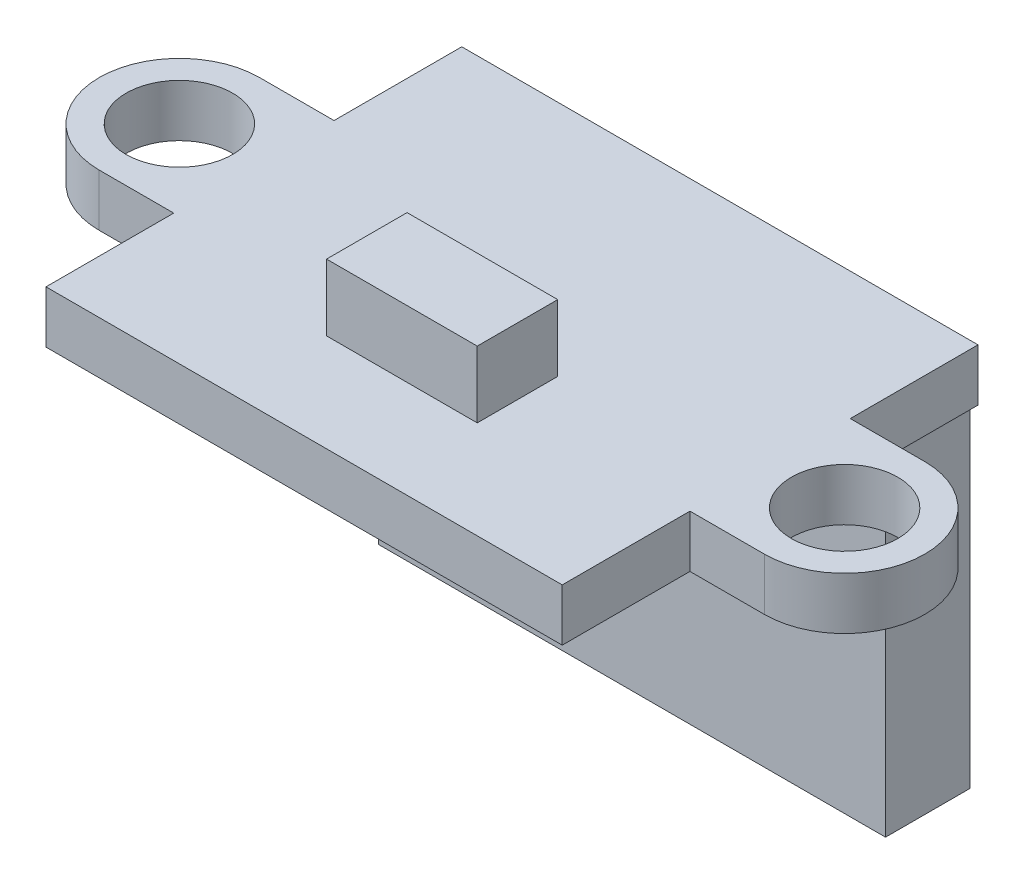
ISO-10303-21;
HEADER;
FILE_DESCRIPTION(('STEP AP214'),'2;1');
FILE_NAME('part.step','',(''),(''),'','','');
FILE_SCHEMA(('AUTOMOTIVE_DESIGN { 1 0 10303 214 1 1 1 1 }'));
ENDSEC;
DATA;
#1=APPLICATION_CONTEXT('core data for automotive mechanical design processes');
#2=APPLICATION_PROTOCOL_DEFINITION('international standard','automotive_design',2000,#1);
#3=PRODUCT_CONTEXT('',#1,'mechanical');
#4=PRODUCT('Part','Part','',(#3));
#5=PRODUCT_RELATED_PRODUCT_CATEGORY('part','',(#4));
#6=PRODUCT_DEFINITION_FORMATION('','',#4);
#7=PRODUCT_DEFINITION_CONTEXT('part definition',#1,'design');
#8=PRODUCT_DEFINITION('design','',#6,#7);
#9=PRODUCT_DEFINITION_SHAPE('','',#8);
#10=(LENGTH_UNIT() NAMED_UNIT(*) SI_UNIT(.MILLI.,.METRE.));
#11=(NAMED_UNIT(*) PLANE_ANGLE_UNIT() SI_UNIT($,.RADIAN.));
#12=(NAMED_UNIT(*) SI_UNIT($,.STERADIAN.) SOLID_ANGLE_UNIT());
#13=UNCERTAINTY_MEASURE_WITH_UNIT(LENGTH_MEASURE(1.E-05),#10,'distance_accuracy_value','');
#14=(GEOMETRIC_REPRESENTATION_CONTEXT(3) GLOBAL_UNCERTAINTY_ASSIGNED_CONTEXT((#13)) GLOBAL_UNIT_ASSIGNED_CONTEXT((#10,
#11,#12)) REPRESENTATION_CONTEXT('',''));
#15=CARTESIAN_POINT('',(0.,0.,0.));
#16=DIRECTION('',(0.,0.,1.));
#17=DIRECTION('',(1.,0.,0.));
#18=AXIS2_PLACEMENT_3D('',#15,#16,#17);
#19=CARTESIAN_POINT('',(-10.,0.,0.));
#20=DIRECTION('',(0.,-1.,0.));
#21=DIRECTION('',(0.,0.,-1.));
#22=AXIS2_PLACEMENT_3D('',#19,#20,#21);
#23=PLANE('',#22);
#24=CARTESIAN_POINT('',(10.,0.,0.));
#25=DIRECTION('',(0.,1.,0.));
#26=DIRECTION('',(0.,0.,1.));
#27=AXIS2_PLACEMENT_3D('',#24,#25,#26);
#28=CIRCLE('',#27,1.6);
#29=CARTESIAN_POINT('',(10.,0.,1.6));
#30=VERTEX_POINT('',#29);
#31=EDGE_CURVE('E233',#30,#30,#28,.T.);
#32=ORIENTED_EDGE('',*,*,#31,.T.);
#33=EDGE_LOOP('',(#32));
#34=FACE_BOUND('',#33,.T.);
#35=DIRECTION('',(0.,0.,-1.));
#36=VECTOR('',#35,1.);
#37=CARTESIAN_POINT('',(7.76,0.,-2.41000000000001));
#38=LINE('',#37,#36);
#39=CARTESIAN_POINT('',(7.76,0.,-2.41000000000001));
#40=VERTEX_POINT('',#39);
#41=CARTESIAN_POINT('',(7.76,0.,-6.25));
#42=VERTEX_POINT('',#41);
#43=EDGE_CURVE('E239',#40,#42,#38,.T.);
#44=ORIENTED_EDGE('',*,*,#43,.F.);
#45=DIRECTION('',(-1.,0.,0.));
#46=VECTOR('',#45,1.);
#47=CARTESIAN_POINT('',(7.76,0.,-2.41000000000001));
#48=LINE('',#47,#46);
#49=CARTESIAN_POINT('',(10.,0.,-2.41));
#50=VERTEX_POINT('',#49);
#51=EDGE_CURVE('E246',#50,#40,#48,.T.);
#52=ORIENTED_EDGE('',*,*,#51,.F.);
#53=CARTESIAN_POINT('',(10.,0.,0.));
#54=DIRECTION('',(0.,1.,0.));
#55=DIRECTION('',(0.,0.,-1.));
#56=AXIS2_PLACEMENT_3D('',#53,#54,#55);
#57=CIRCLE('',#56,2.41);
#58=CARTESIAN_POINT('',(10.,0.,2.41));
#59=VERTEX_POINT('',#58);
#60=EDGE_CURVE('E289',#59,#50,#57,.T.);
#61=ORIENTED_EDGE('',*,*,#60,.F.);
#62=DIRECTION('',(1.,0.,0.));
#63=VECTOR('',#62,1.);
#64=CARTESIAN_POINT('',(7.76,0.,2.41));
#65=LINE('',#64,#63);
#66=CARTESIAN_POINT('',(7.76,0.,2.41));
#67=VERTEX_POINT('',#66);
#68=EDGE_CURVE('E287',#67,#59,#65,.T.);
#69=ORIENTED_EDGE('',*,*,#68,.F.);
#70=DIRECTION('',(0.,0.,-1.));
#71=VECTOR('',#70,1.);
#72=CARTESIAN_POINT('',(7.76,0.,6.25));
#73=LINE('',#72,#71);
#74=CARTESIAN_POINT('',(7.76,0.,6.25));
#75=VERTEX_POINT('',#74);
#76=EDGE_CURVE('E285',#75,#67,#73,.T.);
#77=ORIENTED_EDGE('',*,*,#76,.F.);
#78=DIRECTION('',(1.,0.,0.));
#79=VECTOR('',#78,1.);
#80=CARTESIAN_POINT('',(-7.76,0.,6.25));
#81=LINE('',#80,#79);
#82=CARTESIAN_POINT('',(-7.76,0.,6.25));
#83=VERTEX_POINT('',#82);
#84=EDGE_CURVE('E283',#83,#75,#81,.T.);
#85=ORIENTED_EDGE('',*,*,#84,.F.);
#86=DIRECTION('',(0.,0.,1.));
#87=VECTOR('',#86,1.);
#88=CARTESIAN_POINT('',(-7.76,0.,6.25));
#89=LINE('',#88,#87);
#90=CARTESIAN_POINT('',(-7.76,0.,2.41));
#91=VERTEX_POINT('',#90);
#92=EDGE_CURVE('E281',#91,#83,#89,.T.);
#93=ORIENTED_EDGE('',*,*,#92,.F.);
#94=DIRECTION('',(1.,0.,0.));
#95=VECTOR('',#94,1.);
#96=CARTESIAN_POINT('',(-10.,0.,2.41));
#97=LINE('',#96,#95);
#98=CARTESIAN_POINT('',(-10.,0.,2.41));
#99=VERTEX_POINT('',#98);
#100=EDGE_CURVE('E279',#99,#91,#97,.T.);
#101=ORIENTED_EDGE('',*,*,#100,.F.);
#102=CARTESIAN_POINT('',(-10.,0.,0.));
#103=DIRECTION('',(0.,1.,0.));
#104=DIRECTION('',(0.,0.,-1.));
#105=AXIS2_PLACEMENT_3D('',#102,#103,#104);
#106=CIRCLE('',#105,2.41);
#107=CARTESIAN_POINT('',(-10.,0.,-2.41));
#108=VERTEX_POINT('',#107);
#109=EDGE_CURVE('E277',#108,#99,#106,.T.);
#110=ORIENTED_EDGE('',*,*,#109,.F.);
#111=DIRECTION('',(-1.,0.,0.));
#112=VECTOR('',#111,1.);
#113=CARTESIAN_POINT('',(-10.,0.,-2.41));
#114=LINE('',#113,#112);
#115=CARTESIAN_POINT('',(-7.76,0.,-2.41));
#116=VERTEX_POINT('',#115);
#117=EDGE_CURVE('E275',#116,#108,#114,.T.);
#118=ORIENTED_EDGE('',*,*,#117,.F.);
#119=DIRECTION('',(0.,0.,1.));
#120=VECTOR('',#119,1.);
#121=CARTESIAN_POINT('',(-7.76,0.,-2.41));
#122=LINE('',#121,#120);
#123=CARTESIAN_POINT('',(-7.76,0.,-6.25));
#124=VERTEX_POINT('',#123);
#125=EDGE_CURVE('E273',#124,#116,#122,.T.);
#126=ORIENTED_EDGE('',*,*,#125,.F.);
#127=DIRECTION('',(-1.,0.,0.));
#128=VECTOR('',#127,1.);
#129=CARTESIAN_POINT('',(-7.76,0.,-6.25));
#130=LINE('',#129,#128);
#131=EDGE_CURVE('E271',#42,#124,#130,.T.);
#132=ORIENTED_EDGE('',*,*,#131,.F.);
#133=EDGE_LOOP('',(#44,#52,#61,#69,#77,#85,#93,#101,#110,#118,#126,#132));
#134=FACE_BOUND('',#133,.T.);
#135=CARTESIAN_POINT('',(-10.,0.,0.));
#136=DIRECTION('',(0.,1.,0.));
#137=DIRECTION('',(0.,0.,1.));
#138=AXIS2_PLACEMENT_3D('',#135,#136,#137);
#139=CIRCLE('',#138,1.6);
#140=CARTESIAN_POINT('',(-10.,0.,1.6));
#141=VERTEX_POINT('',#140);
#142=EDGE_CURVE('E229',#141,#141,#139,.T.);
#143=ORIENTED_EDGE('',*,*,#142,.T.);
#144=EDGE_LOOP('',(#143));
#145=FACE_BOUND('',#144,.T.);
#146=DIRECTION('',(-1.,0.,0.));
#147=VECTOR('',#146,1.);
#148=CARTESIAN_POINT('',(-7.62,0.,-3.61));
#149=LINE('',#148,#147);
#150=CARTESIAN_POINT('',(7.62,0.,-3.61));
#151=VERTEX_POINT('',#150);
#152=CARTESIAN_POINT('',(-7.62,0.,-3.61));
#153=VERTEX_POINT('',#152);
#154=EDGE_CURVE('E614',#151,#153,#149,.T.);
#155=ORIENTED_EDGE('',*,*,#154,.F.);
#156=DIRECTION('',(0.,0.,1.));
#157=VECTOR('',#156,1.);
#158=CARTESIAN_POINT('',(7.62,0.,-6.15));
#159=LINE('',#158,#157);
#160=CARTESIAN_POINT('',(7.62,0.,-6.15));
#161=VERTEX_POINT('',#160);
#162=EDGE_CURVE('E193',#161,#151,#159,.T.);
#163=ORIENTED_EDGE('',*,*,#162,.F.);
#164=DIRECTION('',(1.,0.,0.));
#165=VECTOR('',#164,1.);
#166=CARTESIAN_POINT('',(-7.62,0.,-6.15));
#167=LINE('',#166,#165);
#168=CARTESIAN_POINT('',(-7.61999999999999,0.,-6.15));
#169=VERTEX_POINT('',#168);
#170=EDGE_CURVE('E189',#169,#161,#167,.T.);
#171=ORIENTED_EDGE('',*,*,#170,.F.);
#172=DIRECTION('',(0.,0.,-1.));
#173=VECTOR('',#172,1.);
#174=CARTESIAN_POINT('',(-7.62,0.,-6.15));
#175=LINE('',#174,#173);
#176=EDGE_CURVE('E611',#153,#169,#175,.T.);
#177=ORIENTED_EDGE('',*,*,#176,.F.);
#178=EDGE_LOOP('',(#155,#163,#171,#177));
#179=FACE_BOUND('',#178,.T.);
#180=ADVANCED_FACE('F33',(#34,#134,#145,#179),#23,.T.);
#181=CARTESIAN_POINT('',(-10.,1.57,0.));
#182=DIRECTION('',(0.,-1.,0.));
#183=DIRECTION('',(0.,0.,-1.));
#184=AXIS2_PLACEMENT_3D('',#181,#182,#183);
#185=PLANE('',#184);
#186=CARTESIAN_POINT('',(-10.,1.57,0.));
#187=DIRECTION('',(0.,1.,0.));
#188=DIRECTION('',(0.,0.,1.));
#189=AXIS2_PLACEMENT_3D('',#186,#187,#188);
#190=CIRCLE('',#189,1.6);
#191=CARTESIAN_POINT('',(-10.,1.57,1.6));
#192=VERTEX_POINT('',#191);
#193=EDGE_CURVE('E230',#192,#192,#190,.T.);
#194=ORIENTED_EDGE('',*,*,#193,.F.);
#195=EDGE_LOOP('',(#194));
#196=FACE_BOUND('',#195,.T.);
#197=CARTESIAN_POINT('',(10.,1.57,0.));
#198=DIRECTION('',(0.,1.,0.));
#199=DIRECTION('',(0.,0.,1.));
#200=AXIS2_PLACEMENT_3D('',#197,#198,#199);
#201=CIRCLE('',#200,1.6);
#202=CARTESIAN_POINT('',(10.,1.57,1.6));
#203=VERTEX_POINT('',#202);
#204=EDGE_CURVE('E236',#203,#203,#201,.T.);
#205=ORIENTED_EDGE('',*,*,#204,.F.);
#206=EDGE_LOOP('',(#205));
#207=FACE_BOUND('',#206,.T.);
#208=DIRECTION('',(0.,0.,-1.));
#209=VECTOR('',#208,1.);
#210=CARTESIAN_POINT('',(7.76,1.57,-2.41000000000001));
#211=LINE('',#210,#209);
#212=CARTESIAN_POINT('',(7.76,1.57,-2.41000000000001));
#213=VERTEX_POINT('',#212);
#214=CARTESIAN_POINT('',(7.76,1.57,-6.25));
#215=VERTEX_POINT('',#214);
#216=EDGE_CURVE('E242',#213,#215,#211,.T.);
#217=ORIENTED_EDGE('',*,*,#216,.T.);
#218=DIRECTION('',(-1.,0.,0.));
#219=VECTOR('',#218,1.);
#220=CARTESIAN_POINT('',(-7.76,1.57,-6.25));
#221=LINE('',#220,#219);
#222=CARTESIAN_POINT('',(-7.76,1.57,-6.25));
#223=VERTEX_POINT('',#222);
#224=EDGE_CURVE('E245',#215,#223,#221,.T.);
#225=ORIENTED_EDGE('',*,*,#224,.T.);
#226=DIRECTION('',(0.,0.,1.));
#227=VECTOR('',#226,1.);
#228=CARTESIAN_POINT('',(-7.76,1.57,-2.41));
#229=LINE('',#228,#227);
#230=CARTESIAN_POINT('',(-7.76,1.57,-2.41));
#231=VERTEX_POINT('',#230);
#232=EDGE_CURVE('E248',#223,#231,#229,.T.);
#233=ORIENTED_EDGE('',*,*,#232,.T.);
#234=DIRECTION('',(-1.,0.,0.));
#235=VECTOR('',#234,1.);
#236=CARTESIAN_POINT('',(-10.,1.57,-2.41));
#237=LINE('',#236,#235);
#238=CARTESIAN_POINT('',(-10.,1.57,-2.41));
#239=VERTEX_POINT('',#238);
#240=EDGE_CURVE('E250',#231,#239,#237,.T.);
#241=ORIENTED_EDGE('',*,*,#240,.T.);
#242=CARTESIAN_POINT('',(-10.,1.57,0.));
#243=DIRECTION('',(0.,1.,0.));
#244=DIRECTION('',(0.,0.,-1.));
#245=AXIS2_PLACEMENT_3D('',#242,#243,#244);
#246=CIRCLE('',#245,2.41);
#247=CARTESIAN_POINT('',(-10.,1.57,2.41));
#248=VERTEX_POINT('',#247);
#249=EDGE_CURVE('E252',#239,#248,#246,.T.);
#250=ORIENTED_EDGE('',*,*,#249,.T.);
#251=DIRECTION('',(1.,0.,0.));
#252=VECTOR('',#251,1.);
#253=CARTESIAN_POINT('',(-10.,1.57,2.41));
#254=LINE('',#253,#252);
#255=CARTESIAN_POINT('',(-7.76,1.57,2.41));
#256=VERTEX_POINT('',#255);
#257=EDGE_CURVE('E254',#248,#256,#254,.T.);
#258=ORIENTED_EDGE('',*,*,#257,.T.);
#259=DIRECTION('',(0.,0.,1.));
#260=VECTOR('',#259,1.);
#261=CARTESIAN_POINT('',(-7.76,1.57,6.25));
#262=LINE('',#261,#260);
#263=CARTESIAN_POINT('',(-7.76,1.57,6.25));
#264=VERTEX_POINT('',#263);
#265=EDGE_CURVE('E256',#256,#264,#262,.T.);
#266=ORIENTED_EDGE('',*,*,#265,.T.);
#267=DIRECTION('',(1.,0.,0.));
#268=VECTOR('',#267,1.);
#269=CARTESIAN_POINT('',(-7.76,1.57,6.25));
#270=LINE('',#269,#268);
#271=CARTESIAN_POINT('',(7.76,1.57,6.25));
#272=VERTEX_POINT('',#271);
#273=EDGE_CURVE('E258',#264,#272,#270,.T.);
#274=ORIENTED_EDGE('',*,*,#273,.T.);
#275=DIRECTION('',(0.,0.,-1.));
#276=VECTOR('',#275,1.);
#277=CARTESIAN_POINT('',(7.76,1.57,6.25));
#278=LINE('',#277,#276);
#279=CARTESIAN_POINT('',(7.76,1.57,2.41));
#280=VERTEX_POINT('',#279);
#281=EDGE_CURVE('E260',#272,#280,#278,.T.);
#282=ORIENTED_EDGE('',*,*,#281,.T.);
#283=DIRECTION('',(1.,0.,0.));
#284=VECTOR('',#283,1.);
#285=CARTESIAN_POINT('',(7.76,1.57,2.41));
#286=LINE('',#285,#284);
#287=CARTESIAN_POINT('',(10.,1.57,2.41));
#288=VERTEX_POINT('',#287);
#289=EDGE_CURVE('E262',#280,#288,#286,.T.);
#290=ORIENTED_EDGE('',*,*,#289,.T.);
#291=CARTESIAN_POINT('',(10.,1.57,0.));
#292=DIRECTION('',(0.,1.,0.));
#293=DIRECTION('',(0.,0.,-1.));
#294=AXIS2_PLACEMENT_3D('',#291,#292,#293);
#295=CIRCLE('',#294,2.41);
#296=CARTESIAN_POINT('',(10.,1.57,-2.41));
#297=VERTEX_POINT('',#296);
#298=EDGE_CURVE('E264',#288,#297,#295,.T.);
#299=ORIENTED_EDGE('',*,*,#298,.T.);
#300=DIRECTION('',(-1.,0.,0.));
#301=VECTOR('',#300,1.);
#302=CARTESIAN_POINT('',(7.76,1.57,-2.41000000000001));
#303=LINE('',#302,#301);
#304=EDGE_CURVE('E266',#297,#213,#303,.T.);
#305=ORIENTED_EDGE('',*,*,#304,.T.);
#306=EDGE_LOOP('',(#217,#225,#233,#241,#250,#258,#266,#274,#282,#290,#299,#305));
#307=FACE_BOUND('',#306,.T.);
#308=DIRECTION('',(0.,0.,-1.));
#309=VECTOR('',#308,1.);
#310=CARTESIAN_POINT('',(2.265,1.57,3.31));
#311=LINE('',#310,#309);
#312=CARTESIAN_POINT('',(2.265,1.57,3.31));
#313=VERTEX_POINT('',#312);
#314=CARTESIAN_POINT('',(2.265,1.57,0.89));
#315=VERTEX_POINT('',#314);
#316=EDGE_CURVE('E195',#313,#315,#311,.T.);
#317=ORIENTED_EDGE('',*,*,#316,.F.);
#318=DIRECTION('',(1.,0.,0.));
#319=VECTOR('',#318,1.);
#320=CARTESIAN_POINT('',(-2.265,1.57,3.31));
#321=LINE('',#320,#319);
#322=CARTESIAN_POINT('',(-2.265,1.57,3.31));
#323=VERTEX_POINT('',#322);
#324=EDGE_CURVE('E206',#323,#313,#321,.T.);
#325=ORIENTED_EDGE('',*,*,#324,.F.);
#326=DIRECTION('',(0.,0.,1.));
#327=VECTOR('',#326,1.);
#328=CARTESIAN_POINT('',(-2.265,1.57,3.31));
#329=LINE('',#328,#327);
#330=CARTESIAN_POINT('',(-2.265,1.57,0.89));
#331=VERTEX_POINT('',#330);
#332=EDGE_CURVE('E214',#331,#323,#329,.T.);
#333=ORIENTED_EDGE('',*,*,#332,.F.);
#334=DIRECTION('',(-1.,0.,0.));
#335=VECTOR('',#334,1.);
#336=CARTESIAN_POINT('',(-2.265,1.57,0.89));
#337=LINE('',#336,#335);
#338=EDGE_CURVE('E56',#315,#331,#337,.T.);
#339=ORIENTED_EDGE('',*,*,#338,.F.);
#340=EDGE_LOOP('',(#317,#325,#333,#339));
#341=FACE_BOUND('',#340,.T.);
#342=ADVANCED_FACE('F344',(#196,#207,#307,#341),#185,.F.);
#343=CARTESIAN_POINT('',(7.76,1.57,-2.41000000000001));
#344=DIRECTION('',(-1.,0.,0.));
#345=DIRECTION('',(0.,0.,1.));
#346=AXIS2_PLACEMENT_3D('',#343,#344,#345);
#347=PLANE('',#346);
#348=ORIENTED_EDGE('',*,*,#43,.T.);
#349=DIRECTION('',(0.,-1.,0.));
#350=VECTOR('',#349,1.);
#351=CARTESIAN_POINT('',(7.76,1.57,-6.25));
#352=LINE('',#351,#350);
#353=EDGE_CURVE('E11',#215,#42,#352,.T.);
#354=ORIENTED_EDGE('',*,*,#353,.F.);
#355=ORIENTED_EDGE('',*,*,#216,.F.);
#356=DIRECTION('',(0.,-1.,0.));
#357=VECTOR('',#356,1.);
#358=CARTESIAN_POINT('',(7.76,1.57,-2.41000000000001));
#359=LINE('',#358,#357);
#360=EDGE_CURVE('E268',#213,#40,#359,.T.);
#361=ORIENTED_EDGE('',*,*,#360,.T.);
#362=EDGE_LOOP('',(#348,#354,#355,#361));
#363=FACE_BOUND('',#362,.T.);
#364=ADVANCED_FACE('F35',(#363),#347,.F.);
#365=CARTESIAN_POINT('',(-7.76,1.57,-6.25));
#366=DIRECTION('',(0.,0.,1.));
#367=DIRECTION('',(1.,0.,0.));
#368=AXIS2_PLACEMENT_3D('',#365,#366,#367);
#369=PLANE('',#368);
#370=ORIENTED_EDGE('',*,*,#131,.T.);
#371=DIRECTION('',(0.,-1.,0.));
#372=VECTOR('',#371,1.);
#373=CARTESIAN_POINT('',(-7.76,1.57,-6.25));
#374=LINE('',#373,#372);
#375=EDGE_CURVE('E41',#223,#124,#374,.T.);
#376=ORIENTED_EDGE('',*,*,#375,.F.);
#377=ORIENTED_EDGE('',*,*,#224,.F.);
#378=ORIENTED_EDGE('',*,*,#353,.T.);
#379=EDGE_LOOP('',(#370,#376,#377,#378));
#380=FACE_BOUND('',#379,.T.);
#381=ADVANCED_FACE('F348',(#380),#369,.F.);
#382=CARTESIAN_POINT('',(-7.76,1.57,-2.41));
#383=DIRECTION('',(1.,0.,0.));
#384=DIRECTION('',(0.,0.,-1.));
#385=AXIS2_PLACEMENT_3D('',#382,#383,#384);
#386=PLANE('',#385);
#387=ORIENTED_EDGE('',*,*,#125,.T.);
#388=DIRECTION('',(0.,-1.,0.));
#389=VECTOR('',#388,1.);
#390=CARTESIAN_POINT('',(-7.76,1.57,-2.41));
#391=LINE('',#390,#389);
#392=EDGE_CURVE('E318',#231,#116,#391,.T.);
#393=ORIENTED_EDGE('',*,*,#392,.F.);
#394=ORIENTED_EDGE('',*,*,#232,.F.);
#395=ORIENTED_EDGE('',*,*,#375,.T.);
#396=EDGE_LOOP('',(#387,#393,#394,#395));
#397=FACE_BOUND('',#396,.T.);
#398=ADVANCED_FACE('F325',(#397),#386,.F.);
#399=CARTESIAN_POINT('',(-10.,1.57,-2.41));
#400=DIRECTION('',(0.,0.,1.));
#401=DIRECTION('',(1.,0.,0.));
#402=AXIS2_PLACEMENT_3D('',#399,#400,#401);
#403=PLANE('',#402);
#404=ORIENTED_EDGE('',*,*,#117,.T.);
#405=DIRECTION('',(0.,-1.,0.));
#406=VECTOR('',#405,1.);
#407=CARTESIAN_POINT('',(-10.,1.57,-2.41));
#408=LINE('',#407,#406);
#409=EDGE_CURVE('E315',#239,#108,#408,.T.);
#410=ORIENTED_EDGE('',*,*,#409,.F.);
#411=ORIENTED_EDGE('',*,*,#240,.F.);
#412=ORIENTED_EDGE('',*,*,#392,.T.);
#413=EDGE_LOOP('',(#404,#410,#411,#412));
#414=FACE_BOUND('',#413,.T.);
#415=ADVANCED_FACE('F336',(#414),#403,.F.);
#416=CARTESIAN_POINT('',(-10.,1.57,0.));
#417=DIRECTION('',(0.,-1.,0.));
#418=DIRECTION('',(0.,0.,-1.));
#419=AXIS2_PLACEMENT_3D('',#416,#417,#418);
#420=CYLINDRICAL_SURFACE('',#419,2.41);
#421=ORIENTED_EDGE('',*,*,#109,.T.);
#422=DIRECTION('',(0.,-1.,0.));
#423=VECTOR('',#422,1.);
#424=CARTESIAN_POINT('',(-10.,1.57,2.41));
#425=LINE('',#424,#423);
#426=EDGE_CURVE('E312',#248,#99,#425,.T.);
#427=ORIENTED_EDGE('',*,*,#426,.F.);
#428=ORIENTED_EDGE('',*,*,#249,.F.);
#429=ORIENTED_EDGE('',*,*,#409,.T.);
#430=EDGE_LOOP('',(#421,#427,#428,#429));
#431=FACE_BOUND('',#430,.T.);
#432=ADVANCED_FACE('F340',(#431),#420,.T.);
#433=CARTESIAN_POINT('',(-10.,1.57,2.41));
#434=DIRECTION('',(0.,0.,-1.));
#435=DIRECTION('',(-1.,0.,0.));
#436=AXIS2_PLACEMENT_3D('',#433,#434,#435);
#437=PLANE('',#436);
#438=ORIENTED_EDGE('',*,*,#100,.T.);
#439=DIRECTION('',(0.,-1.,0.));
#440=VECTOR('',#439,1.);
#441=CARTESIAN_POINT('',(-7.76,1.57,2.41));
#442=LINE('',#441,#440);
#443=EDGE_CURVE('E309',#256,#91,#442,.T.);
#444=ORIENTED_EDGE('',*,*,#443,.F.);
#445=ORIENTED_EDGE('',*,*,#257,.F.);
#446=ORIENTED_EDGE('',*,*,#426,.T.);
#447=EDGE_LOOP('',(#438,#444,#445,#446));
#448=FACE_BOUND('',#447,.T.);
#449=ADVANCED_FACE('F381',(#448),#437,.F.);
#450=CARTESIAN_POINT('',(-7.76,1.57,6.25));
#451=DIRECTION('',(1.,0.,0.));
#452=DIRECTION('',(0.,0.,-1.));
#453=AXIS2_PLACEMENT_3D('',#450,#451,#452);
#454=PLANE('',#453);
#455=ORIENTED_EDGE('',*,*,#92,.T.);
#456=DIRECTION('',(0.,-1.,0.));
#457=VECTOR('',#456,1.);
#458=CARTESIAN_POINT('',(-7.76,1.57,6.25));
#459=LINE('',#458,#457);
#460=EDGE_CURVE('E306',#264,#83,#459,.T.);
#461=ORIENTED_EDGE('',*,*,#460,.F.);
#462=ORIENTED_EDGE('',*,*,#265,.F.);
#463=ORIENTED_EDGE('',*,*,#443,.T.);
#464=EDGE_LOOP('',(#455,#461,#462,#463));
#465=FACE_BOUND('',#464,.T.);
#466=ADVANCED_FACE('F379',(#465),#454,.F.);
#467=CARTESIAN_POINT('',(-7.76,1.57,6.25));
#468=DIRECTION('',(0.,0.,-1.));
#469=DIRECTION('',(-1.,0.,0.));
#470=AXIS2_PLACEMENT_3D('',#467,#468,#469);
#471=PLANE('',#470);
#472=ORIENTED_EDGE('',*,*,#84,.T.);
#473=DIRECTION('',(0.,-1.,0.));
#474=VECTOR('',#473,1.);
#475=CARTESIAN_POINT('',(7.76,1.57,6.25));
#476=LINE('',#475,#474);
#477=EDGE_CURVE('E303',#272,#75,#476,.T.);
#478=ORIENTED_EDGE('',*,*,#477,.F.);
#479=ORIENTED_EDGE('',*,*,#273,.F.);
#480=ORIENTED_EDGE('',*,*,#460,.T.);
#481=EDGE_LOOP('',(#472,#478,#479,#480));
#482=FACE_BOUND('',#481,.T.);
#483=ADVANCED_FACE('F375',(#482),#471,.F.);
#484=CARTESIAN_POINT('',(7.76,1.57,6.25));
#485=DIRECTION('',(-1.,0.,0.));
#486=DIRECTION('',(0.,0.,1.));
#487=AXIS2_PLACEMENT_3D('',#484,#485,#486);
#488=PLANE('',#487);
#489=ORIENTED_EDGE('',*,*,#76,.T.);
#490=DIRECTION('',(0.,-1.,0.));
#491=VECTOR('',#490,1.);
#492=CARTESIAN_POINT('',(7.76,1.57,2.41));
#493=LINE('',#492,#491);
#494=EDGE_CURVE('E300',#280,#67,#493,.T.);
#495=ORIENTED_EDGE('',*,*,#494,.F.);
#496=ORIENTED_EDGE('',*,*,#281,.F.);
#497=ORIENTED_EDGE('',*,*,#477,.T.);
#498=EDGE_LOOP('',(#489,#495,#496,#497));
#499=FACE_BOUND('',#498,.T.);
#500=ADVANCED_FACE('F370',(#499),#488,.F.);
#501=CARTESIAN_POINT('',(7.76,1.57,2.41));
#502=DIRECTION('',(0.,0.,-1.));
#503=DIRECTION('',(-1.,0.,0.));
#504=AXIS2_PLACEMENT_3D('',#501,#502,#503);
#505=PLANE('',#504);
#506=ORIENTED_EDGE('',*,*,#68,.T.);
#507=DIRECTION('',(0.,-1.,0.));
#508=VECTOR('',#507,1.);
#509=CARTESIAN_POINT('',(10.,1.57,2.41));
#510=LINE('',#509,#508);
#511=EDGE_CURVE('E297',#288,#59,#510,.T.);
#512=ORIENTED_EDGE('',*,*,#511,.F.);
#513=ORIENTED_EDGE('',*,*,#289,.F.);
#514=ORIENTED_EDGE('',*,*,#494,.T.);
#515=EDGE_LOOP('',(#506,#512,#513,#514));
#516=FACE_BOUND('',#515,.T.);
#517=ADVANCED_FACE('F364',(#516),#505,.F.);
#518=CARTESIAN_POINT('',(10.,1.57,0.));
#519=DIRECTION('',(0.,-1.,0.));
#520=DIRECTION('',(0.,0.,-1.));
#521=AXIS2_PLACEMENT_3D('',#518,#519,#520);
#522=CYLINDRICAL_SURFACE('',#521,2.41);
#523=ORIENTED_EDGE('',*,*,#60,.T.);
#524=DIRECTION('',(0.,-1.,0.));
#525=VECTOR('',#524,1.);
#526=CARTESIAN_POINT('',(10.,1.57,-2.41));
#527=LINE('',#526,#525);
#528=EDGE_CURVE('E294',#297,#50,#527,.T.);
#529=ORIENTED_EDGE('',*,*,#528,.F.);
#530=ORIENTED_EDGE('',*,*,#298,.F.);
#531=ORIENTED_EDGE('',*,*,#511,.T.);
#532=EDGE_LOOP('',(#523,#529,#530,#531));
#533=FACE_BOUND('',#532,.T.);
#534=ADVANCED_FACE('F360',(#533),#522,.T.);
#535=CARTESIAN_POINT('',(7.76,1.57,-2.41000000000001));
#536=DIRECTION('',(0.,0.,1.));
#537=DIRECTION('',(1.,0.,0.));
#538=AXIS2_PLACEMENT_3D('',#535,#536,#537);
#539=PLANE('',#538);
#540=ORIENTED_EDGE('',*,*,#51,.T.);
#541=ORIENTED_EDGE('',*,*,#360,.F.);
#542=ORIENTED_EDGE('',*,*,#304,.F.);
#543=ORIENTED_EDGE('',*,*,#528,.T.);
#544=EDGE_LOOP('',(#540,#541,#542,#543));
#545=FACE_BOUND('',#544,.T.);
#546=ADVANCED_FACE('F355',(#545),#539,.F.);
#547=CARTESIAN_POINT('',(10.,1.57,0.));
#548=DIRECTION('',(0.,-1.,0.));
#549=DIRECTION('',(0.,0.,-1.));
#550=AXIS2_PLACEMENT_3D('',#547,#548,#549);
#551=CYLINDRICAL_SURFACE('',#550,1.6);
#552=ORIENTED_EDGE('',*,*,#204,.T.);
#553=EDGE_LOOP('',(#552));
#554=FACE_BOUND('',#553,.T.);
#555=ORIENTED_EDGE('',*,*,#31,.F.);
#556=EDGE_LOOP('',(#555));
#557=FACE_BOUND('',#556,.T.);
#558=ADVANCED_FACE('F402',(#554,#557),#551,.F.);
#559=CARTESIAN_POINT('',(-10.,1.57,0.));
#560=DIRECTION('',(0.,-1.,0.));
#561=DIRECTION('',(0.,0.,-1.));
#562=AXIS2_PLACEMENT_3D('',#559,#560,#561);
#563=CYLINDRICAL_SURFACE('',#562,1.6);
#564=ORIENTED_EDGE('',*,*,#193,.T.);
#565=EDGE_LOOP('',(#564));
#566=FACE_BOUND('',#565,.T.);
#567=ORIENTED_EDGE('',*,*,#142,.F.);
#568=EDGE_LOOP('',(#567));
#569=FACE_BOUND('',#568,.T.);
#570=ADVANCED_FACE('F436',(#566,#569),#563,.F.);
#571=CARTESIAN_POINT('',(2.265,3.57,3.31));
#572=DIRECTION('',(-1.,0.,0.));
#573=DIRECTION('',(0.,0.,1.));
#574=AXIS2_PLACEMENT_3D('',#571,#572,#573);
#575=PLANE('',#574);
#576=ORIENTED_EDGE('',*,*,#316,.T.);
#577=DIRECTION('',(0.,-1.,0.));
#578=VECTOR('',#577,1.);
#579=CARTESIAN_POINT('',(2.265,3.57,0.89));
#580=LINE('',#579,#578);
#581=CARTESIAN_POINT('',(2.265,3.57,0.89));
#582=VERTEX_POINT('',#581);
#583=EDGE_CURVE('E227',#582,#315,#580,.T.);
#584=ORIENTED_EDGE('',*,*,#583,.F.);
#585=DIRECTION('',(0.,0.,-1.));
#586=VECTOR('',#585,1.);
#587=CARTESIAN_POINT('',(2.265,3.57,3.31));
#588=LINE('',#587,#586);
#589=CARTESIAN_POINT('',(2.265,3.57,3.31));
#590=VERTEX_POINT('',#589);
#591=EDGE_CURVE('E202',#590,#582,#588,.T.);
#592=ORIENTED_EDGE('',*,*,#591,.F.);
#593=DIRECTION('',(0.,-1.,0.));
#594=VECTOR('',#593,1.);
#595=CARTESIAN_POINT('',(2.265,3.57,3.31));
#596=LINE('',#595,#594);
#597=EDGE_CURVE('E211',#590,#313,#596,.T.);
#598=ORIENTED_EDGE('',*,*,#597,.T.);
#599=EDGE_LOOP('',(#576,#584,#592,#598));
#600=FACE_BOUND('',#599,.T.);
#601=ADVANCED_FACE('F443',(#600),#575,.F.);
#602=CARTESIAN_POINT('',(-2.265,3.57,0.89));
#603=DIRECTION('',(0.,0.,1.));
#604=DIRECTION('',(1.,0.,0.));
#605=AXIS2_PLACEMENT_3D('',#602,#603,#604);
#606=PLANE('',#605);
#607=ORIENTED_EDGE('',*,*,#338,.T.);
#608=DIRECTION('',(0.,-1.,0.));
#609=VECTOR('',#608,1.);
#610=CARTESIAN_POINT('',(-2.265,3.57,0.89));
#611=LINE('',#610,#609);
#612=CARTESIAN_POINT('',(-2.265,3.57,0.89));
#613=VERTEX_POINT('',#612);
#614=EDGE_CURVE('E224',#613,#331,#611,.T.);
#615=ORIENTED_EDGE('',*,*,#614,.F.);
#616=DIRECTION('',(-1.,0.,0.));
#617=VECTOR('',#616,1.);
#618=CARTESIAN_POINT('',(-2.265,3.57,0.89));
#619=LINE('',#618,#617);
#620=EDGE_CURVE('E205',#582,#613,#619,.T.);
#621=ORIENTED_EDGE('',*,*,#620,.F.);
#622=ORIENTED_EDGE('',*,*,#583,.T.);
#623=EDGE_LOOP('',(#607,#615,#621,#622));
#624=FACE_BOUND('',#623,.T.);
#625=ADVANCED_FACE('F452',(#624),#606,.F.);
#626=CARTESIAN_POINT('',(-2.265,3.57,3.31));
#627=DIRECTION('',(1.,0.,0.));
#628=DIRECTION('',(0.,0.,-1.));
#629=AXIS2_PLACEMENT_3D('',#626,#627,#628);
#630=PLANE('',#629);
#631=ORIENTED_EDGE('',*,*,#332,.T.);
#632=DIRECTION('',(0.,-1.,0.));
#633=VECTOR('',#632,1.);
#634=CARTESIAN_POINT('',(-2.265,3.57,3.31));
#635=LINE('',#634,#633);
#636=CARTESIAN_POINT('',(-2.265,3.57,3.31));
#637=VERTEX_POINT('',#636);
#638=EDGE_CURVE('E221',#637,#323,#635,.T.);
#639=ORIENTED_EDGE('',*,*,#638,.F.);
#640=DIRECTION('',(0.,0.,1.));
#641=VECTOR('',#640,1.);
#642=CARTESIAN_POINT('',(-2.265,3.57,3.31));
#643=LINE('',#642,#641);
#644=EDGE_CURVE('E208',#613,#637,#643,.T.);
#645=ORIENTED_EDGE('',*,*,#644,.F.);
#646=ORIENTED_EDGE('',*,*,#614,.T.);
#647=EDGE_LOOP('',(#631,#639,#645,#646));
#648=FACE_BOUND('',#647,.T.);
#649=ADVANCED_FACE('F460',(#648),#630,.F.);
#650=CARTESIAN_POINT('',(-2.265,3.57,3.31));
#651=DIRECTION('',(0.,0.,-1.));
#652=DIRECTION('',(-1.,0.,0.));
#653=AXIS2_PLACEMENT_3D('',#650,#651,#652);
#654=PLANE('',#653);
#655=ORIENTED_EDGE('',*,*,#324,.T.);
#656=ORIENTED_EDGE('',*,*,#597,.F.);
#657=DIRECTION('',(1.,0.,0.));
#658=VECTOR('',#657,1.);
#659=CARTESIAN_POINT('',(-2.265,3.57,3.31));
#660=LINE('',#659,#658);
#661=EDGE_CURVE('E210',#637,#590,#660,.T.);
#662=ORIENTED_EDGE('',*,*,#661,.F.);
#663=ORIENTED_EDGE('',*,*,#638,.T.);
#664=EDGE_LOOP('',(#655,#656,#662,#663));
#665=FACE_BOUND('',#664,.T.);
#666=ADVANCED_FACE('F468',(#665),#654,.F.);
#667=CARTESIAN_POINT('',(0.,3.57,0.));
#668=DIRECTION('',(0.,-1.,0.));
#669=DIRECTION('',(0.,0.,-1.));
#670=AXIS2_PLACEMENT_3D('',#667,#668,#669);
#671=PLANE('',#670);
#672=ORIENTED_EDGE('',*,*,#591,.T.);
#673=ORIENTED_EDGE('',*,*,#620,.T.);
#674=ORIENTED_EDGE('',*,*,#644,.T.);
#675=ORIENTED_EDGE('',*,*,#661,.T.);
#676=EDGE_LOOP('',(#672,#673,#674,#675));
#677=FACE_BOUND('',#676,.T.);
#678=ADVANCED_FACE('F476',(#677),#671,.F.);
#679=CARTESIAN_POINT('',(7.62,-10.,-6.15));
#680=DIRECTION('',(-1.,0.,0.));
#681=DIRECTION('',(0.,0.,1.));
#682=AXIS2_PLACEMENT_3D('',#679,#680,#681);
#683=PLANE('',#682);
#684=ORIENTED_EDGE('',*,*,#162,.T.);
#685=DIRECTION('',(0.,1.,0.));
#686=VECTOR('',#685,1.);
#687=CARTESIAN_POINT('',(7.62,-10.,-3.61));
#688=LINE('',#687,#686);
#689=CARTESIAN_POINT('',(7.62,-10.,-3.61));
#690=VERTEX_POINT('',#689);
#691=EDGE_CURVE('E174',#690,#151,#688,.T.);
#692=ORIENTED_EDGE('',*,*,#691,.F.);
#693=DIRECTION('',(0.,0.,1.));
#694=VECTOR('',#693,1.);
#695=CARTESIAN_POINT('',(7.62,-10.,-6.15));
#696=LINE('',#695,#694);
#697=CARTESIAN_POINT('',(7.62,-10.,-6.15));
#698=VERTEX_POINT('',#697);
#699=EDGE_CURVE('E181',#698,#690,#696,.T.);
#700=ORIENTED_EDGE('',*,*,#699,.F.);
#701=DIRECTION('',(0.,1.,0.));
#702=VECTOR('',#701,1.);
#703=CARTESIAN_POINT('',(7.62,-10.,-6.15));
#704=LINE('',#703,#702);
#705=EDGE_CURVE('E608',#698,#161,#704,.T.);
#706=ORIENTED_EDGE('',*,*,#705,.T.);
#707=EDGE_LOOP('',(#684,#692,#700,#706));
#708=FACE_BOUND('',#707,.T.);
#709=ADVANCED_FACE('F191',(#708),#683,.F.);
#710=CARTESIAN_POINT('',(-7.62,-10.,-3.61));
#711=DIRECTION('',(0.,0.,-1.));
#712=DIRECTION('',(-1.,0.,0.));
#713=AXIS2_PLACEMENT_3D('',#710,#711,#712);
#714=PLANE('',#713);
#715=ORIENTED_EDGE('',*,*,#154,.T.);
#716=DIRECTION('',(0.,1.,0.));
#717=VECTOR('',#716,1.);
#718=CARTESIAN_POINT('',(-7.62,-10.,-3.61));
#719=LINE('',#718,#717);
#720=CARTESIAN_POINT('',(-7.62,-10.,-3.61));
#721=VERTEX_POINT('',#720);
#722=EDGE_CURVE('E177',#721,#153,#719,.T.);
#723=ORIENTED_EDGE('',*,*,#722,.F.);
#724=DIRECTION('',(-1.,0.,0.));
#725=VECTOR('',#724,1.);
#726=CARTESIAN_POINT('',(-7.62,-10.,-3.61));
#727=LINE('',#726,#725);
#728=EDGE_CURVE('E170',#690,#721,#727,.T.);
#729=ORIENTED_EDGE('',*,*,#728,.F.);
#730=ORIENTED_EDGE('',*,*,#691,.T.);
#731=EDGE_LOOP('',(#715,#723,#729,#730));
#732=FACE_BOUND('',#731,.T.);
#733=ADVANCED_FACE('F172',(#732),#714,.F.);
#734=CARTESIAN_POINT('',(-7.62,-10.,-6.15));
#735=DIRECTION('',(1.,0.,0.));
#736=DIRECTION('',(0.,0.,-1.));
#737=AXIS2_PLACEMENT_3D('',#734,#735,#736);
#738=PLANE('',#737);
#739=ORIENTED_EDGE('',*,*,#176,.T.);
#740=DIRECTION('',(0.,1.,0.));
#741=VECTOR('',#740,1.);
#742=CARTESIAN_POINT('',(-7.62,-10.,-6.15));
#743=LINE('',#742,#741);
#744=CARTESIAN_POINT('',(-7.62,-10.,-6.15));
#745=VERTEX_POINT('',#744);
#746=EDGE_CURVE('E48',#745,#169,#743,.T.);
#747=ORIENTED_EDGE('',*,*,#746,.F.);
#748=DIRECTION('',(0.,0.,-1.));
#749=VECTOR('',#748,1.);
#750=CARTESIAN_POINT('',(-7.62,-10.,-6.15));
#751=LINE('',#750,#749);
#752=EDGE_CURVE('E180',#721,#745,#751,.T.);
#753=ORIENTED_EDGE('',*,*,#752,.F.);
#754=ORIENTED_EDGE('',*,*,#722,.T.);
#755=EDGE_LOOP('',(#739,#747,#753,#754));
#756=FACE_BOUND('',#755,.T.);
#757=ADVANCED_FACE('F497',(#756),#738,.F.);
#758=CARTESIAN_POINT('',(-7.62,-10.,-6.15));
#759=DIRECTION('',(0.,0.,1.));
#760=DIRECTION('',(1.,0.,0.));
#761=AXIS2_PLACEMENT_3D('',#758,#759,#760);
#762=PLANE('',#761);
#763=ORIENTED_EDGE('',*,*,#170,.T.);
#764=ORIENTED_EDGE('',*,*,#705,.F.);
#765=DIRECTION('',(1.,0.,0.));
#766=VECTOR('',#765,1.);
#767=CARTESIAN_POINT('',(-7.62,-10.,-6.15));
#768=LINE('',#767,#766);
#769=EDGE_CURVE('E185',#745,#698,#768,.T.);
#770=ORIENTED_EDGE('',*,*,#769,.F.);
#771=ORIENTED_EDGE('',*,*,#746,.T.);
#772=EDGE_LOOP('',(#763,#764,#770,#771));
#773=FACE_BOUND('',#772,.T.);
#774=ADVANCED_FACE('F504',(#773),#762,.F.);
#775=CARTESIAN_POINT('',(0.,-10.,0.));
#776=DIRECTION('',(0.,1.,0.));
#777=DIRECTION('',(0.,0.,1.));
#778=AXIS2_PLACEMENT_3D('',#775,#776,#777);
#779=PLANE('',#778);
#780=ORIENTED_EDGE('',*,*,#699,.T.);
#781=ORIENTED_EDGE('',*,*,#728,.T.);
#782=ORIENTED_EDGE('',*,*,#752,.T.);
#783=ORIENTED_EDGE('',*,*,#769,.T.);
#784=EDGE_LOOP('',(#780,#781,#782,#783));
#785=FACE_BOUND('',#784,.T.);
#786=ADVANCED_FACE('F184',(#785),#779,.F.);
#787=CLOSED_SHELL('',(#180,#342,#364,#381,#398,#415,#432,#449,#466,#483,#500,#517,#534,#546,
#558,#570,#601,#625,#649,#666,#678,#709,#733,#757,#774,#786));
#788=MANIFOLD_SOLID_BREP('B2',#787);
#789=ADVANCED_BREP_SHAPE_REPRESENTATION('',(#18,#788),#14);
#790=SHAPE_DEFINITION_REPRESENTATION(#9,#789);
ENDSEC;
END-ISO-10303-21;
